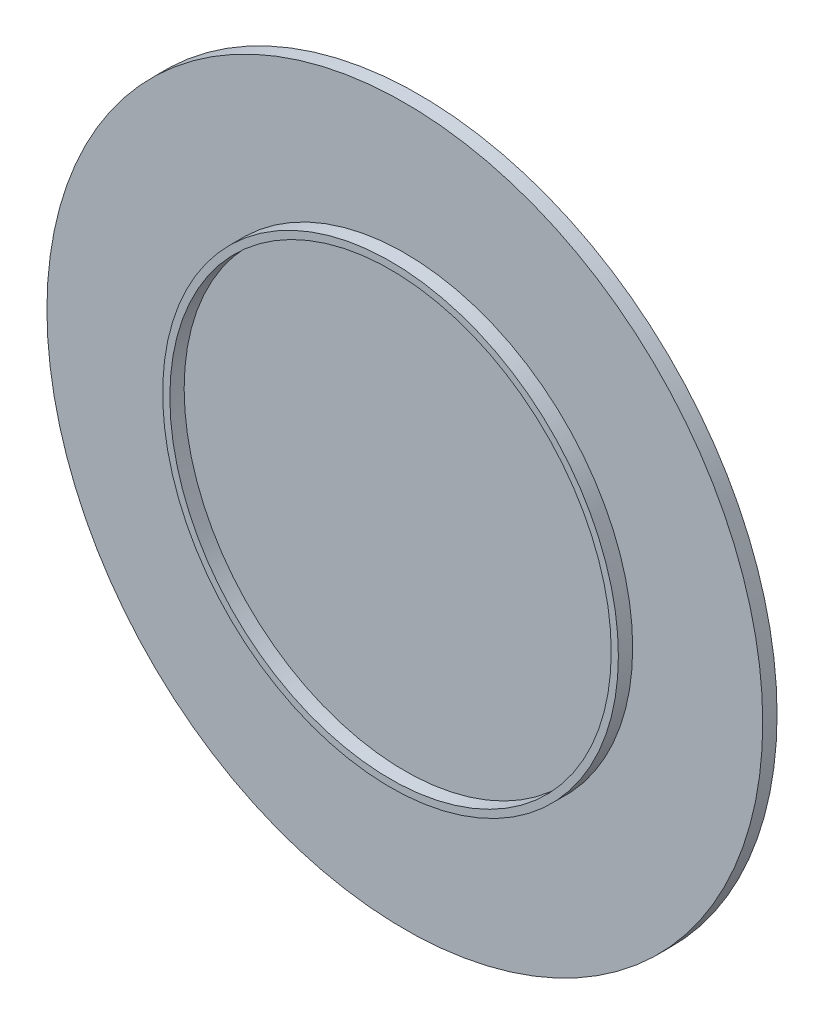
ISO-10303-21;
HEADER;
FILE_DESCRIPTION(('STEP AP214'),'2;1');
FILE_NAME('part.step','',(''),(''),'','','');
FILE_SCHEMA(('AUTOMOTIVE_DESIGN { 1 0 10303 214 1 1 1 1 }'));
ENDSEC;
DATA;
#1=APPLICATION_CONTEXT('core data for automotive mechanical design processes');
#2=APPLICATION_PROTOCOL_DEFINITION('international standard','automotive_design',2000,#1);
#3=PRODUCT_CONTEXT('',#1,'mechanical');
#4=PRODUCT('Part','Part','',(#3));
#5=PRODUCT_RELATED_PRODUCT_CATEGORY('part','',(#4));
#6=PRODUCT_DEFINITION_FORMATION('','',#4);
#7=PRODUCT_DEFINITION_CONTEXT('part definition',#1,'design');
#8=PRODUCT_DEFINITION('design','',#6,#7);
#9=PRODUCT_DEFINITION_SHAPE('','',#8);
#10=(LENGTH_UNIT() NAMED_UNIT(*) SI_UNIT(.MILLI.,.METRE.));
#11=(NAMED_UNIT(*) PLANE_ANGLE_UNIT() SI_UNIT($,.RADIAN.));
#12=(NAMED_UNIT(*) SI_UNIT($,.STERADIAN.) SOLID_ANGLE_UNIT());
#13=UNCERTAINTY_MEASURE_WITH_UNIT(LENGTH_MEASURE(1.E-05),#10,'distance_accuracy_value','');
#14=(GEOMETRIC_REPRESENTATION_CONTEXT(3) GLOBAL_UNCERTAINTY_ASSIGNED_CONTEXT((#13)) GLOBAL_UNIT_ASSIGNED_CONTEXT((#10,
#11,#12)) REPRESENTATION_CONTEXT('',''));
#15=CARTESIAN_POINT('',(0.,0.,0.));
#16=DIRECTION('',(0.,0.,1.));
#17=DIRECTION('',(1.,0.,0.));
#18=AXIS2_PLACEMENT_3D('',#15,#16,#17);
#19=CARTESIAN_POINT('',(0.,0.,10.));
#20=DIRECTION('',(0.,0.,1.));
#21=DIRECTION('',(1.,0.,0.));
#22=AXIS2_PLACEMENT_3D('',#19,#20,#21);
#23=PLANE('',#22);
#24=CARTESIAN_POINT('',(0.,0.,10.));
#25=DIRECTION('',(0.,0.,1.));
#26=DIRECTION('',(1.,0.,0.));
#27=AXIS2_PLACEMENT_3D('',#24,#25,#26);
#28=CIRCLE('',#27,159.1549431);
#29=CARTESIAN_POINT('',(159.1549431,0.,10.));
#30=VERTEX_POINT('',#29);
#31=EDGE_CURVE('E11',#30,#30,#28,.T.);
#32=ORIENTED_EDGE('',*,*,#31,.T.);
#33=EDGE_LOOP('',(#32));
#34=FACE_BOUND('',#33,.T.);
#35=CARTESIAN_POINT('',(0.,0.,10.));
#36=DIRECTION('',(0.,0.,1.));
#37=DIRECTION('',(1.,0.,0.));
#38=AXIS2_PLACEMENT_3D('',#35,#36,#37);
#39=CIRCLE('',#38,154.1549431);
#40=CARTESIAN_POINT('',(154.1549431,0.,10.));
#41=VERTEX_POINT('',#40);
#42=EDGE_CURVE('E46',#41,#41,#39,.T.);
#43=ORIENTED_EDGE('',*,*,#42,.F.);
#44=EDGE_LOOP('',(#43));
#45=FACE_BOUND('',#44,.T.);
#46=ADVANCED_FACE('F39',(#34,#45),#23,.T.);
#47=CARTESIAN_POINT('',(0.,0.,10.));
#48=DIRECTION('',(0.,0.,-1.));
#49=DIRECTION('',(-1.,0.,0.));
#50=AXIS2_PLACEMENT_3D('',#47,#48,#49);
#51=CYLINDRICAL_SURFACE('',#50,159.1549431);
#52=ORIENTED_EDGE('',*,*,#31,.F.);
#53=EDGE_LOOP('',(#52));
#54=FACE_BOUND('',#53,.T.);
#55=CARTESIAN_POINT('',(0.,0.,0.));
#56=DIRECTION('',(0.,0.,1.));
#57=DIRECTION('',(1.,0.,0.));
#58=AXIS2_PLACEMENT_3D('',#55,#56,#57);
#59=CIRCLE('',#58,159.1549431);
#60=CARTESIAN_POINT('',(159.1549431,0.,0.));
#61=VERTEX_POINT('',#60);
#62=EDGE_CURVE('E55',#61,#61,#59,.T.);
#63=ORIENTED_EDGE('',*,*,#62,.T.);
#64=EDGE_LOOP('',(#63));
#65=FACE_BOUND('',#64,.T.);
#66=ADVANCED_FACE('F41',(#54,#65),#51,.T.);
#67=CARTESIAN_POINT('',(0.,0.,10.));
#68=DIRECTION('',(0.,0.,-1.));
#69=DIRECTION('',(-1.,0.,0.));
#70=AXIS2_PLACEMENT_3D('',#67,#68,#69);
#71=CYLINDRICAL_SURFACE('',#70,154.1549431);
#72=ORIENTED_EDGE('',*,*,#42,.T.);
#73=EDGE_LOOP('',(#72));
#74=FACE_BOUND('',#73,.T.);
#75=CARTESIAN_POINT('',(0.,0.,0.));
#76=DIRECTION('',(0.,0.,1.));
#77=DIRECTION('',(1.,0.,0.));
#78=AXIS2_PLACEMENT_3D('',#75,#76,#77);
#79=CIRCLE('',#78,154.1549431);
#80=CARTESIAN_POINT('',(154.1549431,0.,0.));
#81=VERTEX_POINT('',#80);
#82=EDGE_CURVE('E50',#81,#81,#79,.T.);
#83=ORIENTED_EDGE('',*,*,#82,.F.);
#84=EDGE_LOOP('',(#83));
#85=FACE_BOUND('',#84,.T.);
#86=ADVANCED_FACE('F82',(#74,#85),#71,.F.);
#87=CARTESIAN_POINT('',(0.,0.,0.));
#88=DIRECTION('',(0.,0.,1.));
#89=DIRECTION('',(1.,0.,0.));
#90=AXIS2_PLACEMENT_3D('',#87,#88,#89);
#91=PLANE('',#90);
#92=ORIENTED_EDGE('',*,*,#82,.T.);
#93=EDGE_LOOP('',(#92));
#94=FACE_BOUND('',#93,.T.);
#95=ADVANCED_FACE('F87',(#94),#91,.T.);
#96=CARTESIAN_POINT('',(0.,0.,0.));
#97=DIRECTION('',(0.,0.,1.));
#98=DIRECTION('',(1.,0.,0.));
#99=AXIS2_PLACEMENT_3D('',#96,#97,#98);
#100=CIRCLE('',#99,250.);
#101=CARTESIAN_POINT('',(250.,0.,0.));
#102=VERTEX_POINT('',#101);
#103=EDGE_CURVE('E60',#102,#102,#100,.T.);
#104=ORIENTED_EDGE('',*,*,#103,.T.);
#105=EDGE_LOOP('',(#104));
#106=FACE_BOUND('',#105,.T.);
#107=ORIENTED_EDGE('',*,*,#62,.F.);
#108=EDGE_LOOP('',(#107));
#109=FACE_BOUND('',#108,.T.);
#110=ADVANCED_FACE('F75',(#106,#109),#91,.T.);
#111=CARTESIAN_POINT('',(0.,0.,-10.));
#112=DIRECTION('',(0.,0.,1.));
#113=DIRECTION('',(1.,0.,0.));
#114=AXIS2_PLACEMENT_3D('',#111,#112,#113);
#115=CYLINDRICAL_SURFACE('',#114,250.);
#116=CARTESIAN_POINT('',(0.,0.,-10.));
#117=DIRECTION('',(0.,0.,1.));
#118=DIRECTION('',(1.,0.,0.));
#119=AXIS2_PLACEMENT_3D('',#116,#117,#118);
#120=CIRCLE('',#119,250.);
#121=CARTESIAN_POINT('',(250.,0.,-10.));
#122=VERTEX_POINT('',#121);
#123=EDGE_CURVE('E59',#122,#122,#120,.T.);
#124=ORIENTED_EDGE('',*,*,#123,.T.);
#125=EDGE_LOOP('',(#124));
#126=FACE_BOUND('',#125,.T.);
#127=ORIENTED_EDGE('',*,*,#103,.F.);
#128=EDGE_LOOP('',(#127));
#129=FACE_BOUND('',#128,.T.);
#130=ADVANCED_FACE('F66',(#126,#129),#115,.T.);
#131=CARTESIAN_POINT('',(0.,0.,-10.));
#132=DIRECTION('',(0.,0.,1.));
#133=DIRECTION('',(1.,0.,0.));
#134=AXIS2_PLACEMENT_3D('',#131,#132,#133);
#135=PLANE('',#134);
#136=ORIENTED_EDGE('',*,*,#123,.F.);
#137=EDGE_LOOP('',(#136));
#138=FACE_BOUND('',#137,.T.);
#139=ADVANCED_FACE('F69',(#138),#135,.F.);
#140=CLOSED_SHELL('',(#46,#66,#86,#95,#110,#130,#139));
#141=MANIFOLD_SOLID_BREP('B2',#140);
#142=ADVANCED_BREP_SHAPE_REPRESENTATION('',(#18,#141),#14);
#143=SHAPE_DEFINITION_REPRESENTATION(#9,#142);
ENDSEC;
END-ISO-10303-21;
